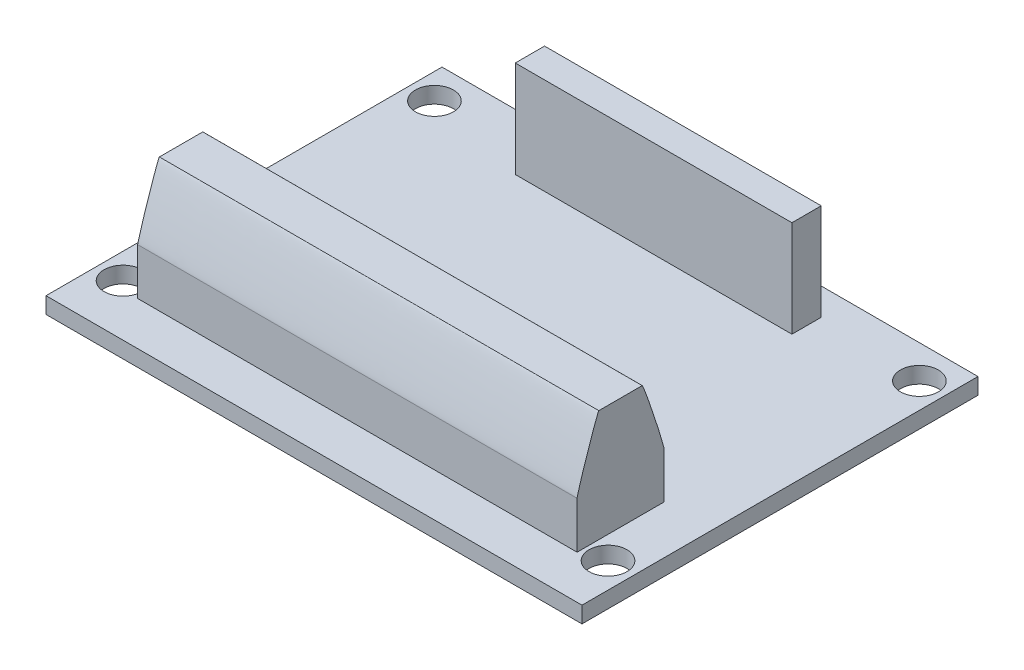
ISO-10303-21;
HEADER;
FILE_DESCRIPTION(('STEP AP214'),'2;1');
FILE_NAME('part.step','',(''),(''),'','','');
FILE_SCHEMA(('AUTOMOTIVE_DESIGN { 1 0 10303 214 1 1 1 1 }'));
ENDSEC;
DATA;
#1=APPLICATION_CONTEXT('core data for automotive mechanical design processes');
#2=APPLICATION_PROTOCOL_DEFINITION('international standard','automotive_design',2000,#1);
#3=PRODUCT_CONTEXT('',#1,'mechanical');
#4=PRODUCT('Part','Part','',(#3));
#5=PRODUCT_RELATED_PRODUCT_CATEGORY('part','',(#4));
#6=PRODUCT_DEFINITION_FORMATION('','',#4);
#7=PRODUCT_DEFINITION_CONTEXT('part definition',#1,'design');
#8=PRODUCT_DEFINITION('design','',#6,#7);
#9=PRODUCT_DEFINITION_SHAPE('','',#8);
#10=(LENGTH_UNIT() NAMED_UNIT(*) SI_UNIT(.MILLI.,.METRE.));
#11=(NAMED_UNIT(*) PLANE_ANGLE_UNIT() SI_UNIT($,.RADIAN.));
#12=(NAMED_UNIT(*) SI_UNIT($,.STERADIAN.) SOLID_ANGLE_UNIT());
#13=UNCERTAINTY_MEASURE_WITH_UNIT(LENGTH_MEASURE(1.E-05),#10,'distance_accuracy_value','');
#14=(GEOMETRIC_REPRESENTATION_CONTEXT(3) GLOBAL_UNCERTAINTY_ASSIGNED_CONTEXT((#13)) GLOBAL_UNIT_ASSIGNED_CONTEXT((#10,
#11,#12)) REPRESENTATION_CONTEXT('',''));
#15=CARTESIAN_POINT('',(0.,0.,0.));
#16=DIRECTION('',(0.,0.,1.));
#17=DIRECTION('',(1.,0.,0.));
#18=AXIS2_PLACEMENT_3D('',#15,#16,#17);
#19=CARTESIAN_POINT('',(0.,1.5,0.));
#20=DIRECTION('',(0.,-1.,0.));
#21=DIRECTION('',(0.,0.,-1.));
#22=AXIS2_PLACEMENT_3D('',#19,#20,#21);
#23=PLANE('',#22);
#24=DIRECTION('',(1.,0.,0.));
#25=VECTOR('',#24,1.);
#26=CARTESIAN_POINT('',(0.,1.5,-0.757811737689194));
#27=LINE('',#26,#25);
#28=CARTESIAN_POINT('',(-113.929682496604,1.5,-0.757811737689194));
#29=VERTEX_POINT('',#28);
#30=CARTESIAN_POINT('',(-88.4296824966038,1.5,-0.757811737689194));
#31=VERTEX_POINT('',#30);
#32=EDGE_CURVE('E121',#29,#31,#27,.T.);
#33=ORIENTED_EDGE('',*,*,#32,.T.);
#34=DIRECTION('',(0.,0.,1.));
#35=VECTOR('',#34,1.);
#36=CARTESIAN_POINT('',(-88.4296824966038,1.5,0.));
#37=LINE('',#36,#35);
#38=CARTESIAN_POINT('',(-88.4296824966038,1.5,1.94218826231081));
#39=VERTEX_POINT('',#38);
#40=EDGE_CURVE('E209',#31,#39,#37,.T.);
#41=ORIENTED_EDGE('',*,*,#40,.T.);
#42=DIRECTION('',(1.,0.,0.));
#43=VECTOR('',#42,1.);
#44=CARTESIAN_POINT('',(0.,1.5,1.94218826231081));
#45=LINE('',#44,#43);
#46=CARTESIAN_POINT('',(-113.929682496604,1.5,1.94218826231081));
#47=VERTEX_POINT('',#46);
#48=EDGE_CURVE('E212',#47,#39,#45,.T.);
#49=ORIENTED_EDGE('',*,*,#48,.F.);
#50=DIRECTION('',(0.,0.,1.));
#51=VECTOR('',#50,1.);
#52=CARTESIAN_POINT('',(-113.929682496604,1.5,0.));
#53=LINE('',#52,#51);
#54=EDGE_CURVE('E126',#29,#47,#53,.T.);
#55=ORIENTED_EDGE('',*,*,#54,.F.);
#56=EDGE_LOOP('',(#33,#41,#49,#55));
#57=FACE_BOUND('',#56,.T.);
#58=DIRECTION('',(1.,0.,0.));
#59=VECTOR('',#58,1.);
#60=CARTESIAN_POINT('',(0.,1.5,21.2421882623108));
#61=LINE('',#60,#59);
#62=CARTESIAN_POINT('',(-121.429682496604,1.5,21.2421882623108));
#63=VERTEX_POINT('',#62);
#64=CARTESIAN_POINT('',(-80.9296824966038,1.5,21.2421882623108));
#65=VERTEX_POINT('',#64);
#66=EDGE_CURVE('E331',#63,#65,#61,.T.);
#67=ORIENTED_EDGE('',*,*,#66,.T.);
#68=DIRECTION('',(0.,0.,1.));
#69=VECTOR('',#68,1.);
#70=CARTESIAN_POINT('',(-80.9296824966038,1.5,0.));
#71=LINE('',#70,#69);
#72=CARTESIAN_POINT('',(-80.9296824966038,1.5,29.2421882623108));
#73=VERTEX_POINT('',#72);
#74=EDGE_CURVE('E325',#65,#73,#71,.T.);
#75=ORIENTED_EDGE('',*,*,#74,.T.);
#76=DIRECTION('',(1.,0.,0.));
#77=VECTOR('',#76,1.);
#78=CARTESIAN_POINT('',(0.,1.5,29.2421882623108));
#79=LINE('',#78,#77);
#80=CARTESIAN_POINT('',(-121.429682496604,1.5,29.2421882623108));
#81=VERTEX_POINT('',#80);
#82=EDGE_CURVE('E311',#81,#73,#79,.T.);
#83=ORIENTED_EDGE('',*,*,#82,.F.);
#84=DIRECTION('',(0.,0.,1.));
#85=VECTOR('',#84,1.);
#86=CARTESIAN_POINT('',(-121.429682496604,1.5,0.));
#87=LINE('',#86,#85);
#88=EDGE_CURVE('E336',#63,#81,#87,.T.);
#89=ORIENTED_EDGE('',*,*,#88,.F.);
#90=EDGE_LOOP('',(#67,#75,#83,#89));
#91=FACE_BOUND('',#90,.T.);
#92=DIRECTION('',(1.,0.,0.));
#93=VECTOR('',#92,1.);
#94=CARTESIAN_POINT('',(-125.879682496604,1.5,-3.25781173768919));
#95=LINE('',#94,#93);
#96=CARTESIAN_POINT('',(-125.879682496604,1.5,-3.25781173768919));
#97=VERTEX_POINT('',#96);
#98=CARTESIAN_POINT('',(-76.4796824966038,1.5,-3.25781173768919));
#99=VERTEX_POINT('',#98);
#100=EDGE_CURVE('E361',#97,#99,#95,.T.);
#101=ORIENTED_EDGE('',*,*,#100,.F.);
#102=DIRECTION('',(0.,0.,1.));
#103=VECTOR('',#102,1.);
#104=CARTESIAN_POINT('',(-125.879682496604,1.5,-3.25781173768919));
#105=LINE('',#104,#103);
#106=CARTESIAN_POINT('',(-125.879682496604,1.5,33.2421882623108));
#107=VERTEX_POINT('',#106);
#108=EDGE_CURVE('E370',#97,#107,#105,.T.);
#109=ORIENTED_EDGE('',*,*,#108,.T.);
#110=DIRECTION('',(1.,0.,0.));
#111=VECTOR('',#110,1.);
#112=CARTESIAN_POINT('',(-125.879682496604,1.5,33.2421882623108));
#113=LINE('',#112,#111);
#114=CARTESIAN_POINT('',(-76.4796824966038,1.5,33.2421882623108));
#115=VERTEX_POINT('',#114);
#116=EDGE_CURVE('E368',#107,#115,#113,.T.);
#117=ORIENTED_EDGE('',*,*,#116,.T.);
#118=DIRECTION('',(0.,0.,1.));
#119=VECTOR('',#118,1.);
#120=CARTESIAN_POINT('',(-76.4796824966038,1.5,-3.25781173768919));
#121=LINE('',#120,#119);
#122=EDGE_CURVE('E364',#99,#115,#121,.T.);
#123=ORIENTED_EDGE('',*,*,#122,.F.);
#124=EDGE_LOOP('',(#101,#109,#117,#123));
#125=FACE_BOUND('',#124,.T.);
#126=CARTESIAN_POINT('',(-123.529682496604,1.5,-0.207811737689194));
#127=DIRECTION('',(0.,1.,0.));
#128=DIRECTION('',(0.,0.,1.));
#129=AXIS2_PLACEMENT_3D('',#126,#127,#128);
#130=CIRCLE('',#129,1.75);
#131=CARTESIAN_POINT('',(-123.529682496604,1.5,1.5421882623108));
#132=VERTEX_POINT('',#131);
#133=EDGE_CURVE('E355',#132,#132,#130,.T.);
#134=ORIENTED_EDGE('',*,*,#133,.F.);
#135=EDGE_LOOP('',(#134));
#136=FACE_BOUND('',#135,.T.);
#137=CARTESIAN_POINT('',(-78.8296824966038,1.5,-0.207811737689194));
#138=DIRECTION('',(0.,1.,0.));
#139=DIRECTION('',(0.,0.,1.));
#140=AXIS2_PLACEMENT_3D('',#137,#138,#139);
#141=CIRCLE('',#140,1.75);
#142=CARTESIAN_POINT('',(-78.8296824966038,1.5,1.5421882623108));
#143=VERTEX_POINT('',#142);
#144=EDGE_CURVE('E349',#143,#143,#141,.T.);
#145=ORIENTED_EDGE('',*,*,#144,.F.);
#146=EDGE_LOOP('',(#145));
#147=FACE_BOUND('',#146,.T.);
#148=CARTESIAN_POINT('',(-123.529682496604,1.5,28.4921882623108));
#149=DIRECTION('',(0.,1.,0.));
#150=DIRECTION('',(0.,0.,1.));
#151=AXIS2_PLACEMENT_3D('',#148,#149,#150);
#152=CIRCLE('',#151,1.75);
#153=CARTESIAN_POINT('',(-123.529682496604,1.5,30.2421882623108));
#154=VERTEX_POINT('',#153);
#155=EDGE_CURVE('E343',#154,#154,#152,.T.);
#156=ORIENTED_EDGE('',*,*,#155,.F.);
#157=EDGE_LOOP('',(#156));
#158=FACE_BOUND('',#157,.T.);
#159=CARTESIAN_POINT('',(-78.8296824966038,1.5,28.4921882623108));
#160=DIRECTION('',(0.,1.,0.));
#161=DIRECTION('',(0.,0.,1.));
#162=AXIS2_PLACEMENT_3D('',#159,#160,#161);
#163=CIRCLE('',#162,1.75);
#164=CARTESIAN_POINT('',(-78.8296824966038,1.5,30.2421882623108));
#165=VERTEX_POINT('',#164);
#166=EDGE_CURVE('E334',#165,#165,#163,.T.);
#167=ORIENTED_EDGE('',*,*,#166,.F.);
#168=EDGE_LOOP('',(#167));
#169=FACE_BOUND('',#168,.T.);
#170=ADVANCED_FACE('F100',(#57,#91,#125,#136,#147,#158,#169),#23,.F.);
#171=CARTESIAN_POINT('',(0.,0.,0.));
#172=DIRECTION('',(0.,-1.,0.));
#173=DIRECTION('',(0.,0.,-1.));
#174=AXIS2_PLACEMENT_3D('',#171,#172,#173);
#175=PLANE('',#174);
#176=CARTESIAN_POINT('',(-123.529682496604,0.,28.4921882623108));
#177=DIRECTION('',(0.,1.,0.));
#178=DIRECTION('',(0.,0.,1.));
#179=AXIS2_PLACEMENT_3D('',#176,#177,#178);
#180=CIRCLE('',#179,1.75);
#181=CARTESIAN_POINT('',(-123.529682496604,0.,30.2421882623108));
#182=VERTEX_POINT('',#181);
#183=EDGE_CURVE('E341',#182,#182,#180,.T.);
#184=ORIENTED_EDGE('',*,*,#183,.T.);
#185=EDGE_LOOP('',(#184));
#186=FACE_BOUND('',#185,.T.);
#187=CARTESIAN_POINT('',(-123.529682496604,0.,-0.207811737689194));
#188=DIRECTION('',(0.,1.,0.));
#189=DIRECTION('',(0.,0.,1.));
#190=AXIS2_PLACEMENT_3D('',#187,#188,#189);
#191=CIRCLE('',#190,1.75);
#192=CARTESIAN_POINT('',(-123.529682496604,0.,1.5421882623108));
#193=VERTEX_POINT('',#192);
#194=EDGE_CURVE('E352',#193,#193,#191,.T.);
#195=ORIENTED_EDGE('',*,*,#194,.T.);
#196=EDGE_LOOP('',(#195));
#197=FACE_BOUND('',#196,.T.);
#198=DIRECTION('',(1.,0.,0.));
#199=VECTOR('',#198,1.);
#200=CARTESIAN_POINT('',(-125.879682496604,0.,-3.25781173768919));
#201=LINE('',#200,#199);
#202=CARTESIAN_POINT('',(-125.879682496604,0.,-3.25781173768919));
#203=VERTEX_POINT('',#202);
#204=CARTESIAN_POINT('',(-76.4796824966038,0.,-3.25781173768919));
#205=VERTEX_POINT('',#204);
#206=EDGE_CURVE('E358',#203,#205,#201,.T.);
#207=ORIENTED_EDGE('',*,*,#206,.T.);
#208=DIRECTION('',(0.,0.,1.));
#209=VECTOR('',#208,1.);
#210=CARTESIAN_POINT('',(-76.4796824966038,0.,-3.25781173768919));
#211=LINE('',#210,#209);
#212=CARTESIAN_POINT('',(-76.4796824966038,0.,33.2421882623108));
#213=VERTEX_POINT('',#212);
#214=EDGE_CURVE('E374',#205,#213,#211,.T.);
#215=ORIENTED_EDGE('',*,*,#214,.T.);
#216=DIRECTION('',(1.,0.,0.));
#217=VECTOR('',#216,1.);
#218=CARTESIAN_POINT('',(-125.879682496604,0.,33.2421882623108));
#219=LINE('',#218,#217);
#220=CARTESIAN_POINT('',(-125.879682496604,0.,33.2421882623108));
#221=VERTEX_POINT('',#220);
#222=EDGE_CURVE('E377',#221,#213,#219,.T.);
#223=ORIENTED_EDGE('',*,*,#222,.F.);
#224=DIRECTION('',(0.,0.,1.));
#225=VECTOR('',#224,1.);
#226=CARTESIAN_POINT('',(-125.879682496604,0.,-3.25781173768919));
#227=LINE('',#226,#225);
#228=EDGE_CURVE('E365',#203,#221,#227,.T.);
#229=ORIENTED_EDGE('',*,*,#228,.F.);
#230=EDGE_LOOP('',(#207,#215,#223,#229));
#231=FACE_BOUND('',#230,.T.);
#232=CARTESIAN_POINT('',(-78.8296824966038,0.,-0.207811737689194));
#233=DIRECTION('',(0.,1.,0.));
#234=DIRECTION('',(0.,0.,1.));
#235=AXIS2_PLACEMENT_3D('',#232,#233,#234);
#236=CIRCLE('',#235,1.75);
#237=CARTESIAN_POINT('',(-78.8296824966038,0.,1.5421882623108));
#238=VERTEX_POINT('',#237);
#239=EDGE_CURVE('E346',#238,#238,#236,.T.);
#240=ORIENTED_EDGE('',*,*,#239,.T.);
#241=EDGE_LOOP('',(#240));
#242=FACE_BOUND('',#241,.T.);
#243=CARTESIAN_POINT('',(-78.8296824966038,0.,28.4921882623108));
#244=DIRECTION('',(0.,1.,0.));
#245=DIRECTION('',(0.,0.,1.));
#246=AXIS2_PLACEMENT_3D('',#243,#244,#245);
#247=CIRCLE('',#246,1.75);
#248=CARTESIAN_POINT('',(-78.8296824966038,0.,30.2421882623108));
#249=VERTEX_POINT('',#248);
#250=EDGE_CURVE('E330',#249,#249,#247,.T.);
#251=ORIENTED_EDGE('',*,*,#250,.T.);
#252=EDGE_LOOP('',(#251));
#253=FACE_BOUND('',#252,.T.);
#254=ADVANCED_FACE('F397',(#186,#197,#231,#242,#253),#175,.T.);
#255=CARTESIAN_POINT('',(-125.879682496604,1.5,-3.25781173768919));
#256=DIRECTION('',(0.,0.,-1.));
#257=DIRECTION('',(-1.,0.,0.));
#258=AXIS2_PLACEMENT_3D('',#255,#256,#257);
#259=PLANE('',#258);
#260=ORIENTED_EDGE('',*,*,#206,.F.);
#261=DIRECTION('',(0.,-1.,0.));
#262=VECTOR('',#261,1.);
#263=CARTESIAN_POINT('',(-125.879682496604,1.5,-3.25781173768919));
#264=LINE('',#263,#262);
#265=EDGE_CURVE('E322',#97,#203,#264,.T.);
#266=ORIENTED_EDGE('',*,*,#265,.F.);
#267=ORIENTED_EDGE('',*,*,#100,.T.);
#268=DIRECTION('',(0.,-1.,0.));
#269=VECTOR('',#268,1.);
#270=CARTESIAN_POINT('',(-76.4796824966038,1.5,-3.25781173768919));
#271=LINE('',#270,#269);
#272=EDGE_CURVE('E309',#99,#205,#271,.T.);
#273=ORIENTED_EDGE('',*,*,#272,.T.);
#274=EDGE_LOOP('',(#260,#266,#267,#273));
#275=FACE_BOUND('',#274,.T.);
#276=ADVANCED_FACE('F390',(#275),#259,.T.);
#277=CARTESIAN_POINT('',(-125.879682496604,1.5,-3.25781173768919));
#278=DIRECTION('',(1.,0.,0.));
#279=DIRECTION('',(0.,0.,-1.));
#280=AXIS2_PLACEMENT_3D('',#277,#278,#279);
#281=PLANE('',#280);
#282=ORIENTED_EDGE('',*,*,#228,.T.);
#283=DIRECTION('',(0.,-1.,0.));
#284=VECTOR('',#283,1.);
#285=CARTESIAN_POINT('',(-125.879682496604,1.5,33.2421882623108));
#286=LINE('',#285,#284);
#287=EDGE_CURVE('E382',#107,#221,#286,.T.);
#288=ORIENTED_EDGE('',*,*,#287,.F.);
#289=ORIENTED_EDGE('',*,*,#108,.F.);
#290=ORIENTED_EDGE('',*,*,#265,.T.);
#291=EDGE_LOOP('',(#282,#288,#289,#290));
#292=FACE_BOUND('',#291,.T.);
#293=ADVANCED_FACE('F401',(#292),#281,.F.);
#294=CARTESIAN_POINT('',(-125.879682496604,1.5,33.2421882623108));
#295=DIRECTION('',(0.,0.,-1.));
#296=DIRECTION('',(-1.,0.,0.));
#297=AXIS2_PLACEMENT_3D('',#294,#295,#296);
#298=PLANE('',#297);
#299=ORIENTED_EDGE('',*,*,#222,.T.);
#300=DIRECTION('',(0.,-1.,0.));
#301=VECTOR('',#300,1.);
#302=CARTESIAN_POINT('',(-76.4796824966038,1.5,33.2421882623108));
#303=LINE('',#302,#301);
#304=EDGE_CURVE('E384',#115,#213,#303,.T.);
#305=ORIENTED_EDGE('',*,*,#304,.F.);
#306=ORIENTED_EDGE('',*,*,#116,.F.);
#307=ORIENTED_EDGE('',*,*,#287,.T.);
#308=EDGE_LOOP('',(#299,#305,#306,#307));
#309=FACE_BOUND('',#308,.T.);
#310=ADVANCED_FACE('F405',(#309),#298,.F.);
#311=CARTESIAN_POINT('',(-76.4796824966038,1.5,-3.25781173768919));
#312=DIRECTION('',(1.,0.,0.));
#313=DIRECTION('',(0.,0.,-1.));
#314=AXIS2_PLACEMENT_3D('',#311,#312,#313);
#315=PLANE('',#314);
#316=ORIENTED_EDGE('',*,*,#214,.F.);
#317=ORIENTED_EDGE('',*,*,#272,.F.);
#318=ORIENTED_EDGE('',*,*,#122,.T.);
#319=ORIENTED_EDGE('',*,*,#304,.T.);
#320=EDGE_LOOP('',(#316,#317,#318,#319));
#321=FACE_BOUND('',#320,.T.);
#322=ADVANCED_FACE('F393',(#321),#315,.T.);
#323=CARTESIAN_POINT('',(-123.529682496604,1.5,-0.207811737689194));
#324=DIRECTION('',(0.,-1.,0.));
#325=DIRECTION('',(0.,0.,-1.));
#326=AXIS2_PLACEMENT_3D('',#323,#324,#325);
#327=CYLINDRICAL_SURFACE('',#326,1.75);
#328=ORIENTED_EDGE('',*,*,#133,.T.);
#329=EDGE_LOOP('',(#328));
#330=FACE_BOUND('',#329,.T.);
#331=ORIENTED_EDGE('',*,*,#194,.F.);
#332=EDGE_LOOP('',(#331));
#333=FACE_BOUND('',#332,.T.);
#334=ADVANCED_FACE('F438',(#330,#333),#327,.F.);
#335=CARTESIAN_POINT('',(-78.8296824966038,1.5,-0.207811737689194));
#336=DIRECTION('',(0.,-1.,0.));
#337=DIRECTION('',(0.,0.,-1.));
#338=AXIS2_PLACEMENT_3D('',#335,#336,#337);
#339=CYLINDRICAL_SURFACE('',#338,1.75);
#340=ORIENTED_EDGE('',*,*,#144,.T.);
#341=EDGE_LOOP('',(#340));
#342=FACE_BOUND('',#341,.T.);
#343=ORIENTED_EDGE('',*,*,#239,.F.);
#344=EDGE_LOOP('',(#343));
#345=FACE_BOUND('',#344,.T.);
#346=ADVANCED_FACE('F703',(#342,#345),#339,.F.);
#347=CARTESIAN_POINT('',(-123.529682496604,1.5,28.4921882623108));
#348=DIRECTION('',(0.,-1.,0.));
#349=DIRECTION('',(0.,0.,-1.));
#350=AXIS2_PLACEMENT_3D('',#347,#348,#349);
#351=CYLINDRICAL_SURFACE('',#350,1.75);
#352=ORIENTED_EDGE('',*,*,#155,.T.);
#353=EDGE_LOOP('',(#352));
#354=FACE_BOUND('',#353,.T.);
#355=ORIENTED_EDGE('',*,*,#183,.F.);
#356=EDGE_LOOP('',(#355));
#357=FACE_BOUND('',#356,.T.);
#358=ADVANCED_FACE('F420',(#354,#357),#351,.F.);
#359=CARTESIAN_POINT('',(-78.8296824966038,1.5,28.4921882623108));
#360=DIRECTION('',(0.,-1.,0.));
#361=DIRECTION('',(0.,0.,-1.));
#362=AXIS2_PLACEMENT_3D('',#359,#360,#361);
#363=CYLINDRICAL_SURFACE('',#362,1.75);
#364=ORIENTED_EDGE('',*,*,#166,.T.);
#365=EDGE_LOOP('',(#364));
#366=FACE_BOUND('',#365,.T.);
#367=ORIENTED_EDGE('',*,*,#250,.F.);
#368=EDGE_LOOP('',(#367));
#369=FACE_BOUND('',#368,.T.);
#370=ADVANCED_FACE('F276',(#366,#369),#363,.F.);
#371=CARTESIAN_POINT('',(-80.9296824966038,11.8,0.));
#372=DIRECTION('',(1.,0.,0.));
#373=DIRECTION('',(0.,0.,-1.));
#374=AXIS2_PLACEMENT_3D('',#371,#372,#373);
#375=PLANE('',#374);
#376=DIRECTION('',(0.,0.,1.));
#377=VECTOR('',#376,1.);
#378=CARTESIAN_POINT('',(-80.9296824966038,11.8,0.));
#379=LINE('',#378,#377);
#380=CARTESIAN_POINT('',(-80.9296824966038,11.8,23.2421882623108));
#381=VERTEX_POINT('',#380);
#382=CARTESIAN_POINT('',(-80.9296824966038,11.8,27.2421882623108));
#383=VERTEX_POINT('',#382);
#384=EDGE_CURVE('E242',#381,#383,#379,.T.);
#385=ORIENTED_EDGE('',*,*,#384,.T.);
#386=CARTESIAN_POINT('',(-80.9296824966038,5.8,29.2421882623108));
#387=CARTESIAN_POINT('',(-80.9296824966038,11.8,29.2421882623108));
#388=CARTESIAN_POINT('',(-80.9296824966038,11.8,27.2421882623108));
#389=(BOUNDED_CURVE() B_SPLINE_CURVE(2,(#386,#387,#388),.UNSPECIFIED.,.F.,
.F.) B_SPLINE_CURVE_WITH_KNOTS((3,3),(0.,1.),
.UNSPECIFIED.) CURVE() GEOMETRIC_REPRESENTATION_ITEM() RATIONAL_B_SPLINE_CURVE((1.,
0.0526315789473684,1.)) REPRESENTATION_ITEM(''));
#390=CARTESIAN_POINT('',(-80.9296824966038,5.8,29.2421882623108));
#391=VERTEX_POINT('',#390);
#392=EDGE_CURVE('E574',#383,#391,#389,.F.);
#393=ORIENTED_EDGE('',*,*,#392,.T.);
#394=DIRECTION('',(0.,-1.,0.));
#395=VECTOR('',#394,1.);
#396=CARTESIAN_POINT('',(-80.9296824966038,11.8,29.2421882623108));
#397=LINE('',#396,#395);
#398=EDGE_CURVE('E296',#391,#73,#397,.T.);
#399=ORIENTED_EDGE('',*,*,#398,.T.);
#400=ORIENTED_EDGE('',*,*,#74,.F.);
#401=DIRECTION('',(0.,-1.,0.));
#402=VECTOR('',#401,1.);
#403=CARTESIAN_POINT('',(-80.9296824966038,11.8,21.2421882623108));
#404=LINE('',#403,#402);
#405=CARTESIAN_POINT('',(-80.9296824966038,5.8,21.2421882623108));
#406=VERTEX_POINT('',#405);
#407=EDGE_CURVE('E308',#406,#65,#404,.T.);
#408=ORIENTED_EDGE('',*,*,#407,.F.);
#409=CARTESIAN_POINT('',(-80.9296824966038,11.8,23.2421882623108));
#410=CARTESIAN_POINT('',(-80.9296824966038,11.8,21.2421882623108));
#411=CARTESIAN_POINT('',(-80.9296824966038,5.8,21.2421882623108));
#412=(BOUNDED_CURVE() B_SPLINE_CURVE(2,(#409,#410,#411),.UNSPECIFIED.,.F.,
.F.) B_SPLINE_CURVE_WITH_KNOTS((3,3),(0.,1.),
.UNSPECIFIED.) CURVE() GEOMETRIC_REPRESENTATION_ITEM() RATIONAL_B_SPLINE_CURVE((1.,
0.0526315789473684,1.)) REPRESENTATION_ITEM(''));
#413=EDGE_CURVE('E259',#406,#381,#412,.F.);
#414=ORIENTED_EDGE('',*,*,#413,.T.);
#415=EDGE_LOOP('',(#385,#393,#399,#400,#408,#414));
#416=FACE_BOUND('',#415,.T.);
#417=ADVANCED_FACE('F266',(#416),#375,.T.);
#418=CARTESIAN_POINT('',(0.,11.8,21.2421882623108));
#419=DIRECTION('',(0.,0.,-1.));
#420=DIRECTION('',(-1.,0.,0.));
#421=AXIS2_PLACEMENT_3D('',#418,#419,#420);
#422=PLANE('',#421);
#423=DIRECTION('',(0.,-1.,0.));
#424=VECTOR('',#423,1.);
#425=CARTESIAN_POINT('',(-121.429682496604,11.8,21.2421882623108));
#426=LINE('',#425,#424);
#427=CARTESIAN_POINT('',(-121.429682496604,5.8,21.2421882623108));
#428=VERTEX_POINT('',#427);
#429=EDGE_CURVE('E295',#428,#63,#426,.T.);
#430=ORIENTED_EDGE('',*,*,#429,.F.);
#431=CARTESIAN_POINT('',(-78.9046824966038,5.8,21.2421882623108));
#432=CARTESIAN_POINT('',(-93.7546824966038,5.8,21.2421882623108));
#433=CARTESIAN_POINT('',(-108.604682496604,5.8,21.2421882623108));
#434=CARTESIAN_POINT('',(-123.454682496604,5.8,21.2421882623108));
#435=(BOUNDED_CURVE() B_SPLINE_CURVE(3,(#431,#432,#433,#434),.UNSPECIFIED.,.F.,
.F.) B_SPLINE_CURVE_WITH_KNOTS((4,4),(-0.123454682496604,-0.0789046824966038),
.UNSPECIFIED.) CURVE() GEOMETRIC_REPRESENTATION_ITEM() RATIONAL_B_SPLINE_CURVE((1.,1.,1.,1.)) REPRESENTATION_ITEM(''));
#436=EDGE_CURVE('E316',#428,#406,#435,.F.);
#437=ORIENTED_EDGE('',*,*,#436,.T.);
#438=ORIENTED_EDGE('',*,*,#407,.T.);
#439=ORIENTED_EDGE('',*,*,#66,.F.);
#440=EDGE_LOOP('',(#430,#437,#438,#439));
#441=FACE_BOUND('',#440,.T.);
#442=ADVANCED_FACE('F275',(#441),#422,.T.);
#443=CARTESIAN_POINT('',(-121.429682496604,11.8,0.));
#444=DIRECTION('',(1.,0.,0.));
#445=DIRECTION('',(0.,0.,-1.));
#446=AXIS2_PLACEMENT_3D('',#443,#444,#445);
#447=PLANE('',#446);
#448=DIRECTION('',(0.,-1.,0.));
#449=VECTOR('',#448,1.);
#450=CARTESIAN_POINT('',(-121.429682496604,11.8,29.2421882623108));
#451=LINE('',#450,#449);
#452=CARTESIAN_POINT('',(-121.429682496604,5.8,29.2421882623108));
#453=VERTEX_POINT('',#452);
#454=EDGE_CURVE('E287',#453,#81,#451,.T.);
#455=ORIENTED_EDGE('',*,*,#454,.F.);
#456=CARTESIAN_POINT('',(-121.429682496604,11.8,27.2421882623108));
#457=CARTESIAN_POINT('',(-121.429682496604,11.8,29.2421882623108));
#458=CARTESIAN_POINT('',(-121.429682496604,5.8,29.2421882623108));
#459=(BOUNDED_CURVE() B_SPLINE_CURVE(2,(#456,#457,#458),.UNSPECIFIED.,.F.,
.F.) B_SPLINE_CURVE_WITH_KNOTS((3,3),(0.,1.),
.UNSPECIFIED.) CURVE() GEOMETRIC_REPRESENTATION_ITEM() RATIONAL_B_SPLINE_CURVE((1.,
0.0526315789473684,1.)) REPRESENTATION_ITEM(''));
#460=CARTESIAN_POINT('',(-121.429682496604,11.8,27.2421882623108));
#461=VERTEX_POINT('',#460);
#462=EDGE_CURVE('E13',#453,#461,#459,.F.);
#463=ORIENTED_EDGE('',*,*,#462,.T.);
#464=DIRECTION('',(0.,0.,1.));
#465=VECTOR('',#464,1.);
#466=CARTESIAN_POINT('',(-121.429682496604,11.8,0.));
#467=LINE('',#466,#465);
#468=CARTESIAN_POINT('',(-121.429682496604,11.8,23.2421882623108));
#469=VERTEX_POINT('',#468);
#470=EDGE_CURVE('E251',#469,#461,#467,.T.);
#471=ORIENTED_EDGE('',*,*,#470,.F.);
#472=CARTESIAN_POINT('',(-121.429682496604,5.8,21.2421882623108));
#473=CARTESIAN_POINT('',(-121.429682496604,11.8,21.2421882623108));
#474=CARTESIAN_POINT('',(-121.429682496604,11.8,23.2421882623108));
#475=(BOUNDED_CURVE() B_SPLINE_CURVE(2,(#472,#473,#474),.UNSPECIFIED.,.F.,
.F.) B_SPLINE_CURVE_WITH_KNOTS((3,3),(0.,1.),
.UNSPECIFIED.) CURVE() GEOMETRIC_REPRESENTATION_ITEM() RATIONAL_B_SPLINE_CURVE((1.,
0.0526315789473684,1.)) REPRESENTATION_ITEM(''));
#476=EDGE_CURVE('E549',#469,#428,#475,.F.);
#477=ORIENTED_EDGE('',*,*,#476,.T.);
#478=ORIENTED_EDGE('',*,*,#429,.T.);
#479=ORIENTED_EDGE('',*,*,#88,.T.);
#480=EDGE_LOOP('',(#455,#463,#471,#477,#478,#479));
#481=FACE_BOUND('',#480,.T.);
#482=ADVANCED_FACE('F552',(#481),#447,.F.);
#483=CARTESIAN_POINT('',(0.,11.8,29.2421882623108));
#484=DIRECTION('',(0.,0.,-1.));
#485=DIRECTION('',(-1.,0.,0.));
#486=AXIS2_PLACEMENT_3D('',#483,#484,#485);
#487=PLANE('',#486);
#488=ORIENTED_EDGE('',*,*,#398,.F.);
#489=CARTESIAN_POINT('',(-123.454682496604,5.8,29.2421882623108));
#490=CARTESIAN_POINT('',(-108.604682496604,5.8,29.2421882623108));
#491=CARTESIAN_POINT('',(-93.7546824966037,5.8,29.2421882623108));
#492=CARTESIAN_POINT('',(-78.9046824966038,5.8,29.2421882623108));
#493=(BOUNDED_CURVE() B_SPLINE_CURVE(3,(#489,#490,#491,#492),.UNSPECIFIED.,.F.,
.F.) B_SPLINE_CURVE_WITH_KNOTS((4,4),(0.0789046824966038,0.123454682496604),
.UNSPECIFIED.) CURVE() GEOMETRIC_REPRESENTATION_ITEM() RATIONAL_B_SPLINE_CURVE((1.,1.,1.,1.)) REPRESENTATION_ITEM(''));
#494=EDGE_CURVE('E114',#391,#453,#493,.F.);
#495=ORIENTED_EDGE('',*,*,#494,.T.);
#496=ORIENTED_EDGE('',*,*,#454,.T.);
#497=ORIENTED_EDGE('',*,*,#82,.T.);
#498=EDGE_LOOP('',(#488,#495,#496,#497));
#499=FACE_BOUND('',#498,.T.);
#500=ADVANCED_FACE('F533',(#499),#487,.F.);
#501=CARTESIAN_POINT('',(0.,11.8,0.));
#502=DIRECTION('',(0.,1.,0.));
#503=DIRECTION('',(0.,0.,1.));
#504=AXIS2_PLACEMENT_3D('',#501,#502,#503);
#505=PLANE('',#504);
#506=ORIENTED_EDGE('',*,*,#470,.T.);
#507=CARTESIAN_POINT('',(-78.9046824966038,11.8,27.2421882623108));
#508=CARTESIAN_POINT('',(-93.7546824966037,11.8,27.2421882623108));
#509=CARTESIAN_POINT('',(-108.604682496604,11.8,27.2421882623108));
#510=CARTESIAN_POINT('',(-123.454682496604,11.8,27.2421882623108));
#511=(BOUNDED_CURVE() B_SPLINE_CURVE(3,(#507,#508,#509,#510),.UNSPECIFIED.,.F.,
.F.) B_SPLINE_CURVE_WITH_KNOTS((4,4),(0.0789046824966038,0.123454682496604),
.UNSPECIFIED.) CURVE() GEOMETRIC_REPRESENTATION_ITEM() RATIONAL_B_SPLINE_CURVE((1.,1.,1.,1.)) REPRESENTATION_ITEM(''));
#512=EDGE_CURVE('E520',#461,#383,#511,.F.);
#513=ORIENTED_EDGE('',*,*,#512,.T.);
#514=ORIENTED_EDGE('',*,*,#384,.F.);
#515=CARTESIAN_POINT('',(-123.454682496604,11.8,23.2421882623108));
#516=CARTESIAN_POINT('',(-108.604682496604,11.8,23.2421882623108));
#517=CARTESIAN_POINT('',(-93.7546824966038,11.8,23.2421882623108));
#518=CARTESIAN_POINT('',(-78.9046824966038,11.8,23.2421882623108));
#519=(BOUNDED_CURVE() B_SPLINE_CURVE(3,(#515,#516,#517,#518),.UNSPECIFIED.,.F.,
.F.) B_SPLINE_CURVE_WITH_KNOTS((4,4),(-0.123454682496604,-0.0789046824966038),
.UNSPECIFIED.) CURVE() GEOMETRIC_REPRESENTATION_ITEM() RATIONAL_B_SPLINE_CURVE((1.,1.,1.,1.)) REPRESENTATION_ITEM(''));
#520=EDGE_CURVE('E603',#381,#469,#519,.F.);
#521=ORIENTED_EDGE('',*,*,#520,.T.);
#522=EDGE_LOOP('',(#506,#513,#514,#521));
#523=FACE_BOUND('',#522,.T.);
#524=ADVANCED_FACE('F447',(#523),#505,.T.);
#525=CARTESIAN_POINT('',(-123.454682496604,5.8,21.2421882623108));
#526=CARTESIAN_POINT('',(-108.604682496604,5.8,21.2421882623108));
#527=CARTESIAN_POINT('',(-93.7546824966038,5.8,21.2421882623108));
#528=CARTESIAN_POINT('',(-78.9046824966038,5.8,21.2421882623108));
#529=CARTESIAN_POINT('',(-123.454682496604,11.8,21.2421882623108));
#530=CARTESIAN_POINT('',(-108.604682496604,11.8,21.2421882623108));
#531=CARTESIAN_POINT('',(-93.7546824966038,11.8,21.2421882623108));
#532=CARTESIAN_POINT('',(-78.9046824966038,11.8,21.2421882623108));
#533=CARTESIAN_POINT('',(-123.454682496604,11.8,23.2421882623108));
#534=CARTESIAN_POINT('',(-108.604682496604,11.8,23.2421882623108));
#535=CARTESIAN_POINT('',(-93.7546824966038,11.8,23.2421882623108));
#536=CARTESIAN_POINT('',(-78.9046824966038,11.8,23.2421882623108));
#537=(BOUNDED_SURFACE() B_SPLINE_SURFACE(2,3,((#525,#526,#527,#528),(#529,#530,#531,#532),(#533,
#534,#535,#536)),.UNSPECIFIED.,.F.,.F.,.F.) B_SPLINE_SURFACE_WITH_KNOTS((3,3),(4,4),(0.,1.),
(-0.123454682496604,-0.0789046824966038),
.UNSPECIFIED.) GEOMETRIC_REPRESENTATION_ITEM() RATIONAL_B_SPLINE_SURFACE(((1.,1.,1.,1.),
(0.0526315789473684,0.0526315789473684,0.0526315789473684,0.0526315789473684),(1.,1.,1.,1.))) REPRESENTATION_ITEM('') SURFACE());
#538=ORIENTED_EDGE('',*,*,#476,.F.);
#539=ORIENTED_EDGE('',*,*,#520,.F.);
#540=ORIENTED_EDGE('',*,*,#413,.F.);
#541=ORIENTED_EDGE('',*,*,#436,.F.);
#542=EDGE_LOOP('',(#538,#539,#540,#541));
#543=FACE_BOUND('',#542,.T.);
#544=ADVANCED_FACE('F440',(#543),#537,.T.);
#545=CARTESIAN_POINT('',(-78.9046824966038,5.8,29.2421882623108));
#546=CARTESIAN_POINT('',(-93.7546824966037,5.8,29.2421882623108));
#547=CARTESIAN_POINT('',(-108.604682496604,5.8,29.2421882623108));
#548=CARTESIAN_POINT('',(-123.454682496604,5.8,29.2421882623108));
#549=CARTESIAN_POINT('',(-78.9046824966038,11.8,29.2421882623108));
#550=CARTESIAN_POINT('',(-93.7546824966038,11.8,29.2421882623108));
#551=CARTESIAN_POINT('',(-108.604682496604,11.8,29.2421882623108));
#552=CARTESIAN_POINT('',(-123.454682496604,11.8,29.2421882623108));
#553=CARTESIAN_POINT('',(-78.9046824966038,11.8,27.2421882623108));
#554=CARTESIAN_POINT('',(-93.7546824966037,11.8,27.2421882623108));
#555=CARTESIAN_POINT('',(-108.604682496604,11.8,27.2421882623108));
#556=CARTESIAN_POINT('',(-123.454682496604,11.8,27.2421882623108));
#557=(BOUNDED_SURFACE() B_SPLINE_SURFACE(2,3,((#545,#546,#547,#548),(#549,#550,#551,#552),(#553,
#554,#555,#556)),.UNSPECIFIED.,.F.,.F.,.F.) B_SPLINE_SURFACE_WITH_KNOTS((3,3),(4,4),(0.,1.),
(0.0789046824966038,0.123454682496604),
.UNSPECIFIED.) GEOMETRIC_REPRESENTATION_ITEM() RATIONAL_B_SPLINE_SURFACE(((1.,1.,1.,1.),
(0.0526315789473684,0.0526315789473684,0.0526315789473684,0.0526315789473684),(1.,1.,1.,1.))) REPRESENTATION_ITEM('') SURFACE());
#558=ORIENTED_EDGE('',*,*,#462,.F.);
#559=ORIENTED_EDGE('',*,*,#494,.F.);
#560=ORIENTED_EDGE('',*,*,#392,.F.);
#561=ORIENTED_EDGE('',*,*,#512,.F.);
#562=EDGE_LOOP('',(#558,#559,#560,#561));
#563=FACE_BOUND('',#562,.T.);
#564=ADVANCED_FACE('F103',(#563),#557,.T.);
#565=CARTESIAN_POINT('',(-88.4296824966038,10.4,0.));
#566=DIRECTION('',(1.,0.,0.));
#567=DIRECTION('',(0.,0.,-1.));
#568=AXIS2_PLACEMENT_3D('',#565,#566,#567);
#569=PLANE('',#568);
#570=ORIENTED_EDGE('',*,*,#40,.F.);
#571=DIRECTION('',(0.,-1.,0.));
#572=VECTOR('',#571,1.);
#573=CARTESIAN_POINT('',(-88.4296824966038,10.4,-0.757811737689194));
#574=LINE('',#573,#572);
#575=CARTESIAN_POINT('',(-88.4296824966038,10.4,-0.757811737689194));
#576=VERTEX_POINT('',#575);
#577=EDGE_CURVE('E204',#576,#31,#574,.T.);
#578=ORIENTED_EDGE('',*,*,#577,.F.);
#579=DIRECTION('',(0.,0.,1.));
#580=VECTOR('',#579,1.);
#581=CARTESIAN_POINT('',(-88.4296824966038,10.4,0.));
#582=LINE('',#581,#580);
#583=CARTESIAN_POINT('',(-88.4296824966038,10.4,1.94218826231081));
#584=VERTEX_POINT('',#583);
#585=EDGE_CURVE('E208',#576,#584,#582,.T.);
#586=ORIENTED_EDGE('',*,*,#585,.T.);
#587=DIRECTION('',(0.,-1.,0.));
#588=VECTOR('',#587,1.);
#589=CARTESIAN_POINT('',(-88.4296824966038,10.4,1.94218826231081));
#590=LINE('',#589,#588);
#591=EDGE_CURVE('E231',#584,#39,#590,.T.);
#592=ORIENTED_EDGE('',*,*,#591,.T.);
#593=EDGE_LOOP('',(#570,#578,#586,#592));
#594=FACE_BOUND('',#593,.T.);
#595=ADVANCED_FACE('F206',(#594),#569,.T.);
#596=CARTESIAN_POINT('',(0.,10.4,-0.757811737689194));
#597=DIRECTION('',(0.,0.,-1.));
#598=DIRECTION('',(-1.,0.,0.));
#599=AXIS2_PLACEMENT_3D('',#596,#597,#598);
#600=PLANE('',#599);
#601=ORIENTED_EDGE('',*,*,#32,.F.);
#602=DIRECTION('',(0.,-1.,0.));
#603=VECTOR('',#602,1.);
#604=CARTESIAN_POINT('',(-113.929682496604,10.4,-0.757811737689194));
#605=LINE('',#604,#603);
#606=CARTESIAN_POINT('',(-113.929682496604,10.4,-0.757811737689194));
#607=VERTEX_POINT('',#606);
#608=EDGE_CURVE('E213',#607,#29,#605,.T.);
#609=ORIENTED_EDGE('',*,*,#608,.F.);
#610=DIRECTION('',(1.,0.,0.));
#611=VECTOR('',#610,1.);
#612=CARTESIAN_POINT('',(0.,10.4,-0.757811737689194));
#613=LINE('',#612,#611);
#614=EDGE_CURVE('E218',#607,#576,#613,.T.);
#615=ORIENTED_EDGE('',*,*,#614,.T.);
#616=ORIENTED_EDGE('',*,*,#577,.T.);
#617=EDGE_LOOP('',(#601,#609,#615,#616));
#618=FACE_BOUND('',#617,.T.);
#619=ADVANCED_FACE('F223',(#618),#600,.T.);
#620=CARTESIAN_POINT('',(-113.929682496604,10.4,0.));
#621=DIRECTION('',(1.,0.,0.));
#622=DIRECTION('',(0.,0.,-1.));
#623=AXIS2_PLACEMENT_3D('',#620,#621,#622);
#624=PLANE('',#623);
#625=ORIENTED_EDGE('',*,*,#608,.T.);
#626=ORIENTED_EDGE('',*,*,#54,.T.);
#627=DIRECTION('',(0.,-1.,0.));
#628=VECTOR('',#627,1.);
#629=CARTESIAN_POINT('',(-113.929682496604,10.4,1.94218826231081));
#630=LINE('',#629,#628);
#631=CARTESIAN_POINT('',(-113.929682496604,10.4,1.94218826231081));
#632=VERTEX_POINT('',#631);
#633=EDGE_CURVE('E233',#632,#47,#630,.T.);
#634=ORIENTED_EDGE('',*,*,#633,.F.);
#635=DIRECTION('',(0.,0.,1.));
#636=VECTOR('',#635,1.);
#637=CARTESIAN_POINT('',(-113.929682496604,10.4,0.));
#638=LINE('',#637,#636);
#639=EDGE_CURVE('E226',#607,#632,#638,.T.);
#640=ORIENTED_EDGE('',*,*,#639,.F.);
#641=EDGE_LOOP('',(#625,#626,#634,#640));
#642=FACE_BOUND('',#641,.T.);
#643=ADVANCED_FACE('F639',(#642),#624,.F.);
#644=CARTESIAN_POINT('',(0.,10.4,1.94218826231081));
#645=DIRECTION('',(0.,0.,-1.));
#646=DIRECTION('',(-1.,0.,0.));
#647=AXIS2_PLACEMENT_3D('',#644,#645,#646);
#648=PLANE('',#647);
#649=ORIENTED_EDGE('',*,*,#633,.T.);
#650=ORIENTED_EDGE('',*,*,#48,.T.);
#651=ORIENTED_EDGE('',*,*,#591,.F.);
#652=DIRECTION('',(1.,0.,0.));
#653=VECTOR('',#652,1.);
#654=CARTESIAN_POINT('',(0.,10.4,1.94218826231081));
#655=LINE('',#654,#653);
#656=EDGE_CURVE('E220',#632,#584,#655,.T.);
#657=ORIENTED_EDGE('',*,*,#656,.F.);
#658=EDGE_LOOP('',(#649,#650,#651,#657));
#659=FACE_BOUND('',#658,.T.);
#660=ADVANCED_FACE('F645',(#659),#648,.F.);
#661=CARTESIAN_POINT('',(0.,10.4,0.));
#662=DIRECTION('',(0.,1.,0.));
#663=DIRECTION('',(0.,0.,1.));
#664=AXIS2_PLACEMENT_3D('',#661,#662,#663);
#665=PLANE('',#664);
#666=ORIENTED_EDGE('',*,*,#585,.F.);
#667=ORIENTED_EDGE('',*,*,#614,.F.);
#668=ORIENTED_EDGE('',*,*,#639,.T.);
#669=ORIENTED_EDGE('',*,*,#656,.T.);
#670=EDGE_LOOP('',(#666,#667,#668,#669));
#671=FACE_BOUND('',#670,.T.);
#672=ADVANCED_FACE('F217',(#671),#665,.T.);
#673=CLOSED_SHELL('',(#170,#254,#276,#293,#310,#322,#334,#346,#358,#370,#417,#442,#482,#500,
#524,#544,#564,#595,#619,#643,#660,#672));
#674=MANIFOLD_SOLID_BREP('B2',#673);
#675=ADVANCED_BREP_SHAPE_REPRESENTATION('',(#18,#674),#14);
#676=SHAPE_DEFINITION_REPRESENTATION(#9,#675);
ENDSEC;
END-ISO-10303-21;
